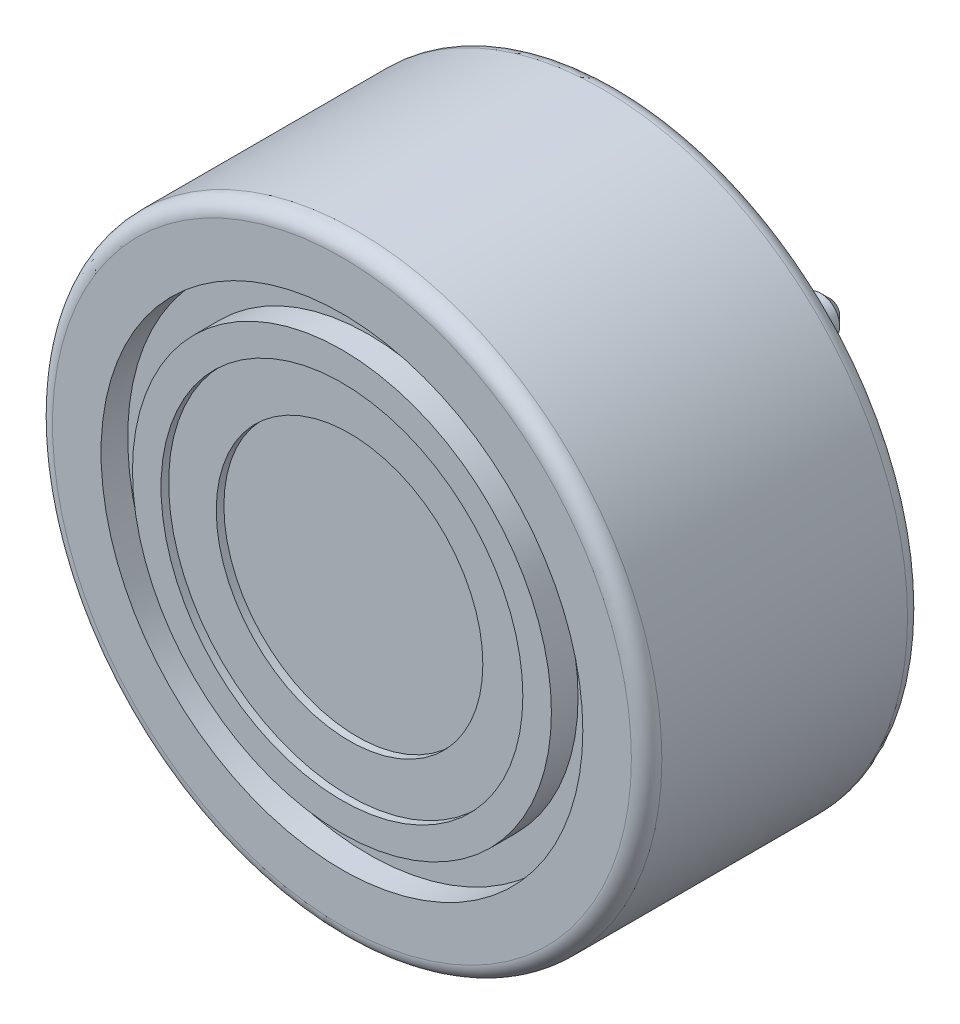
ISO-10303-21;
HEADER;
FILE_DESCRIPTION(('STEP AP214'),'2;1');
FILE_NAME('part.step','',(''),(''),'','','');
FILE_SCHEMA(('AUTOMOTIVE_DESIGN { 1 0 10303 214 1 1 1 1 }'));
ENDSEC;
DATA;
#1=APPLICATION_CONTEXT('core data for automotive mechanical design processes');
#2=APPLICATION_PROTOCOL_DEFINITION('international standard','automotive_design',2000,#1);
#3=PRODUCT_CONTEXT('',#1,'mechanical');
#4=PRODUCT('Part','Part','',(#3));
#5=PRODUCT_RELATED_PRODUCT_CATEGORY('part','',(#4));
#6=PRODUCT_DEFINITION_FORMATION('','',#4);
#7=PRODUCT_DEFINITION_CONTEXT('part definition',#1,'design');
#8=PRODUCT_DEFINITION('design','',#6,#7);
#9=PRODUCT_DEFINITION_SHAPE('','',#8);
#10=(LENGTH_UNIT() NAMED_UNIT(*) SI_UNIT(.MILLI.,.METRE.));
#11=(NAMED_UNIT(*) PLANE_ANGLE_UNIT() SI_UNIT($,.RADIAN.));
#12=(NAMED_UNIT(*) SI_UNIT($,.STERADIAN.) SOLID_ANGLE_UNIT());
#13=UNCERTAINTY_MEASURE_WITH_UNIT(LENGTH_MEASURE(1.E-05),#10,'distance_accuracy_value','');
#14=(GEOMETRIC_REPRESENTATION_CONTEXT(3) GLOBAL_UNCERTAINTY_ASSIGNED_CONTEXT((#13)) GLOBAL_UNIT_ASSIGNED_CONTEXT((#10,
#11,#12)) REPRESENTATION_CONTEXT('',''));
#15=CARTESIAN_POINT('',(0.,0.,0.));
#16=DIRECTION('',(0.,0.,1.));
#17=DIRECTION('',(1.,0.,0.));
#18=AXIS2_PLACEMENT_3D('',#15,#16,#17);
#19=CARTESIAN_POINT('',(0.,0.,14.5));
#20=DIRECTION('',(0.,0.,-1.));
#21=DIRECTION('',(-1.,0.,0.));
#22=AXIS2_PLACEMENT_3D('',#19,#20,#21);
#23=CYLINDRICAL_SURFACE('',#22,16.);
#24=CARTESIAN_POINT('',(0.,0.,0.8));
#25=DIRECTION('',(0.,0.,1.));
#26=DIRECTION('',(1.,0.,0.));
#27=AXIS2_PLACEMENT_3D('',#24,#25,#26);
#28=CIRCLE('',#27,16.);
#29=CARTESIAN_POINT('',(-16.,0.,0.799999999999999));
#30=VERTEX_POINT('',#29);
#31=EDGE_CURVE('E87',#30,#30,#28,.T.);
#32=CARTESIAN_POINT('',(0.,0.,13.7));
#33=DIRECTION('',(0.,0.,1.));
#34=DIRECTION('',(1.,0.,0.));
#35=AXIS2_PLACEMENT_3D('',#32,#33,#34);
#36=CIRCLE('',#35,16.);
#37=CARTESIAN_POINT('',(-16.,0.,13.7));
#38=VERTEX_POINT('',#37);
#39=EDGE_CURVE('E91',#38,#38,#36,.F.);
#40=CARTESIAN_POINT('',(-16.,0.,0.799999999999999));
#41=CARTESIAN_POINT('',(-16.,0.,0.934374999999999));
#42=CARTESIAN_POINT('',(-16.,0.,1.06875));
#43=CARTESIAN_POINT('',(-16.,0.,1.3375));
#44=CARTESIAN_POINT('',(-16.,0.,1.471875));
#45=CARTESIAN_POINT('',(-16.,0.,1.740625));
#46=CARTESIAN_POINT('',(-16.,0.,1.875));
#47=CARTESIAN_POINT('',(-16.,0.,2.14375));
#48=CARTESIAN_POINT('',(-16.,0.,2.278125));
#49=CARTESIAN_POINT('',(-16.,0.,2.546875));
#50=CARTESIAN_POINT('',(-16.,0.,2.68125));
#51=CARTESIAN_POINT('',(-16.,0.,2.95));
#52=CARTESIAN_POINT('',(-16.,0.,3.084375));
#53=CARTESIAN_POINT('',(-16.,0.,3.353125));
#54=CARTESIAN_POINT('',(-16.,0.,3.4875));
#55=CARTESIAN_POINT('',(-16.,0.,3.75625));
#56=CARTESIAN_POINT('',(-16.,0.,3.890625));
#57=CARTESIAN_POINT('',(-16.,0.,4.159375));
#58=CARTESIAN_POINT('',(-16.,0.,4.29375));
#59=CARTESIAN_POINT('',(-16.,0.,4.5625));
#60=CARTESIAN_POINT('',(-16.,0.,4.696875));
#61=CARTESIAN_POINT('',(-16.,0.,4.965625));
#62=CARTESIAN_POINT('',(-16.,0.,5.1));
#63=CARTESIAN_POINT('',(-16.,0.,5.36875));
#64=CARTESIAN_POINT('',(-16.,0.,5.503125));
#65=CARTESIAN_POINT('',(-16.,0.,5.771875));
#66=CARTESIAN_POINT('',(-16.,0.,5.90625));
#67=CARTESIAN_POINT('',(-16.,0.,6.175));
#68=CARTESIAN_POINT('',(-16.,0.,6.309375));
#69=CARTESIAN_POINT('',(-16.,0.,6.578125));
#70=CARTESIAN_POINT('',(-16.,0.,6.7125));
#71=CARTESIAN_POINT('',(-16.,0.,6.98125));
#72=CARTESIAN_POINT('',(-16.,0.,7.115625));
#73=CARTESIAN_POINT('',(-16.,0.,7.384375));
#74=CARTESIAN_POINT('',(-16.,0.,7.51875));
#75=CARTESIAN_POINT('',(-16.,0.,7.7875));
#76=CARTESIAN_POINT('',(-16.,0.,7.921875));
#77=CARTESIAN_POINT('',(-16.,0.,8.190625));
#78=CARTESIAN_POINT('',(-16.,0.,8.325));
#79=CARTESIAN_POINT('',(-16.,0.,8.59375));
#80=CARTESIAN_POINT('',(-16.,0.,8.728125));
#81=CARTESIAN_POINT('',(-16.,0.,8.996875));
#82=CARTESIAN_POINT('',(-16.,0.,9.13125));
#83=CARTESIAN_POINT('',(-16.,0.,9.4));
#84=CARTESIAN_POINT('',(-16.,0.,9.534375));
#85=CARTESIAN_POINT('',(-16.,0.,9.803125));
#86=CARTESIAN_POINT('',(-16.,0.,9.9375));
#87=CARTESIAN_POINT('',(-16.,0.,10.20625));
#88=CARTESIAN_POINT('',(-16.,0.,10.340625));
#89=CARTESIAN_POINT('',(-16.,0.,10.609375));
#90=CARTESIAN_POINT('',(-16.,0.,10.74375));
#91=CARTESIAN_POINT('',(-16.,0.,11.0125));
#92=CARTESIAN_POINT('',(-16.,0.,11.146875));
#93=CARTESIAN_POINT('',(-16.,0.,11.415625));
#94=CARTESIAN_POINT('',(-16.,0.,11.55));
#95=CARTESIAN_POINT('',(-16.,0.,11.81875));
#96=CARTESIAN_POINT('',(-16.,0.,11.953125));
#97=CARTESIAN_POINT('',(-16.,0.,12.221875));
#98=CARTESIAN_POINT('',(-16.,0.,12.35625));
#99=CARTESIAN_POINT('',(-16.,0.,12.625));
#100=CARTESIAN_POINT('',(-16.,0.,12.759375));
#101=CARTESIAN_POINT('',(-16.,0.,13.028125));
#102=CARTESIAN_POINT('',(-16.,0.,13.1625));
#103=CARTESIAN_POINT('',(-16.,0.,13.43125));
#104=CARTESIAN_POINT('',(-16.,0.,13.565625));
#105=CARTESIAN_POINT('',(-16.,0.,13.7));
#106=B_SPLINE_CURVE_WITH_KNOTS('',3,(#40,#41,#42,#43,#44,#45,#46,#47,#48,#49,#50,#51,#52,#53,
#54,#55,#56,#57,#58,#59,#60,#61,#62,#63,#64,#65,#66,#67,#68,#69,#70,#71,#72,#73,#74,#75,#76,#77,
#78,#79,#80,#81,#82,#83,#84,#85,#86,#87,#88,#89,#90,#91,#92,#93,#94,#95,#96,#97,#98,#99,#100,
#101,#102,#103,#104,#105),.UNSPECIFIED.,.F.,.F.,(4,2,2,2,2,2,2,2,2,2,2,2,2,2,2,2,2,2,2,2,2,2,2,
2,2,2,2,2,2,2,2,2,4),(0.,0.403125000000001,0.80625,1.209375,1.6125,2.015625,2.41875,2.821875,
3.225,3.628125,4.03125,4.434375,4.8375,5.240625,5.64375,6.046875,6.45,6.853125,7.25625,7.659375,
8.0625,8.465625,8.86875,9.271875,9.675,10.078125,10.48125,10.884375,11.2875,11.690625,12.09375,
12.496875,12.9),.UNSPECIFIED.);
#107=EDGE_CURVE('BSEAM49',#30,#38,#106,.T.);
#108=ORIENTED_EDGE('',*,*,#31,.T.);
#109=ORIENTED_EDGE('',*,*,#39,.T.);
#110=ORIENTED_EDGE('',*,*,#107,.T.);
#111=ORIENTED_EDGE('',*,*,#107,.F.);
#112=EDGE_LOOP('',(#108,#110,#109,#111));
#113=FACE_BOUND('',#112,.T.);
#114=ADVANCED_FACE('F49',(#113),#23,.T.);
#115=CARTESIAN_POINT('',(0.,0.,14.5));
#116=DIRECTION('',(0.,0.,1.));
#117=DIRECTION('',(1.,0.,0.));
#118=AXIS2_PLACEMENT_3D('',#115,#116,#117);
#119=PLANE('',#118);
#120=CARTESIAN_POINT('',(0.,0.,14.5));
#121=DIRECTION('',(0.,0.,1.));
#122=DIRECTION('',(1.,0.,0.));
#123=AXIS2_PLACEMENT_3D('',#120,#121,#122);
#124=CIRCLE('',#123,15.2);
#125=CARTESIAN_POINT('',(15.2,0.,14.5));
#126=VERTEX_POINT('',#125);
#127=EDGE_CURVE('E79',#126,#126,#124,.T.);
#128=ORIENTED_EDGE('',*,*,#127,.T.);
#129=EDGE_LOOP('',(#128));
#130=FACE_BOUND('',#129,.T.);
#131=CARTESIAN_POINT('',(0.,0.,14.5));
#132=DIRECTION('',(0.,0.,1.));
#133=DIRECTION('',(1.,0.,0.));
#134=AXIS2_PLACEMENT_3D('',#131,#132,#133);
#135=CIRCLE('',#134,12.65);
#136=CARTESIAN_POINT('',(12.65,0.,14.5));
#137=VERTEX_POINT('',#136);
#138=EDGE_CURVE('E134',#137,#137,#135,.T.);
#139=ORIENTED_EDGE('',*,*,#138,.F.);
#140=EDGE_LOOP('',(#139));
#141=FACE_BOUND('',#140,.T.);
#142=ADVANCED_FACE('F207',(#130,#141),#119,.T.);
#143=CARTESIAN_POINT('',(0.,0.,0.));
#144=DIRECTION('',(0.,0.,1.));
#145=DIRECTION('',(1.,0.,0.));
#146=AXIS2_PLACEMENT_3D('',#143,#144,#145);
#147=PLANE('',#146);
#148=CARTESIAN_POINT('',(0.,0.,0.));
#149=DIRECTION('',(0.,0.,1.));
#150=DIRECTION('',(1.,0.,0.));
#151=AXIS2_PLACEMENT_3D('',#148,#149,#150);
#152=CIRCLE('',#151,15.2);
#153=CARTESIAN_POINT('',(15.2,0.,0.));
#154=VERTEX_POINT('',#153);
#155=EDGE_CURVE('E83',#154,#154,#152,.F.);
#156=ORIENTED_EDGE('',*,*,#155,.T.);
#157=EDGE_LOOP('',(#156));
#158=FACE_BOUND('',#157,.T.);
#159=CARTESIAN_POINT('',(0.,0.,0.));
#160=DIRECTION('',(0.,0.,1.));
#161=DIRECTION('',(1.,0.,0.));
#162=AXIS2_PLACEMENT_3D('',#159,#160,#161);
#163=CIRCLE('',#162,12.);
#164=CARTESIAN_POINT('',(12.,0.,0.));
#165=VERTEX_POINT('',#164);
#166=EDGE_CURVE('E130',#165,#165,#163,.F.);
#167=ORIENTED_EDGE('',*,*,#166,.F.);
#168=EDGE_LOOP('',(#167));
#169=FACE_BOUND('',#168,.T.);
#170=ADVANCED_FACE('F212',(#158,#169),#147,.F.);
#171=CARTESIAN_POINT('',(0.,0.,-1.4));
#172=DIRECTION('',(0.,0.,-1.));
#173=DIRECTION('',(-1.,0.,0.));
#174=AXIS2_PLACEMENT_3D('',#171,#172,#173);
#175=PLANE('',#174);
#176=CARTESIAN_POINT('',(0.,0.,-1.4));
#177=DIRECTION('',(0.,0.,-1.));
#178=DIRECTION('',(-1.,0.,0.));
#179=AXIS2_PLACEMENT_3D('',#176,#177,#178);
#180=CIRCLE('',#179,11.1);
#181=CARTESIAN_POINT('',(-11.1,0.,-1.4));
#182=VERTEX_POINT('',#181);
#183=EDGE_CURVE('E57',#182,#182,#180,.F.);
#184=ORIENTED_EDGE('',*,*,#183,.T.);
#185=EDGE_LOOP('',(#184));
#186=FACE_BOUND('',#185,.T.);
#187=CARTESIAN_POINT('',(0.,0.,-1.4));
#188=DIRECTION('',(0.,0.,-1.));
#189=DIRECTION('',(-1.,0.,0.));
#190=AXIS2_PLACEMENT_3D('',#187,#188,#189);
#191=CIRCLE('',#190,11.8);
#192=CARTESIAN_POINT('',(-11.8,0.,-1.4));
#193=VERTEX_POINT('',#192);
#194=EDGE_CURVE('E65',#193,#193,#191,.T.);
#195=ORIENTED_EDGE('',*,*,#194,.T.);
#196=EDGE_LOOP('',(#195));
#197=FACE_BOUND('',#196,.T.);
#198=ADVANCED_FACE('F203',(#186,#197),#175,.T.);
#199=CARTESIAN_POINT('',(0.,0.,-1.4));
#200=DIRECTION('',(0.,0.,1.));
#201=DIRECTION('',(1.,0.,0.));
#202=AXIS2_PLACEMENT_3D('',#199,#200,#201);
#203=CYLINDRICAL_SURFACE('',#202,12.);
#204=CARTESIAN_POINT('',(0.,0.,-1.2));
#205=DIRECTION('',(0.,0.,-1.));
#206=DIRECTION('',(-1.,0.,0.));
#207=AXIS2_PLACEMENT_3D('',#204,#205,#206);
#208=CIRCLE('',#207,12.);
#209=CARTESIAN_POINT('',(-12.,0.,-1.2));
#210=VERTEX_POINT('',#209);
#211=EDGE_CURVE('E10',#210,#210,#208,.F.);
#212=ORIENTED_EDGE('',*,*,#211,.T.);
#213=EDGE_LOOP('',(#212));
#214=FACE_BOUND('',#213,.T.);
#215=ORIENTED_EDGE('',*,*,#166,.T.);
#216=EDGE_LOOP('',(#215));
#217=FACE_BOUND('',#216,.T.);
#218=ADVANCED_FACE('F198',(#214,#217),#203,.T.);
#219=CARTESIAN_POINT('',(0.,0.,-1.4));
#220=DIRECTION('',(0.,0.,1.));
#221=DIRECTION('',(1.,0.,0.));
#222=AXIS2_PLACEMENT_3D('',#219,#220,#221);
#223=CYLINDRICAL_SURFACE('',#222,10.9);
#224=CARTESIAN_POINT('',(0.,0.,-1.2));
#225=DIRECTION('',(0.,0.,-1.));
#226=DIRECTION('',(-1.,0.,0.));
#227=AXIS2_PLACEMENT_3D('',#224,#225,#226);
#228=CIRCLE('',#227,10.9);
#229=CARTESIAN_POINT('',(-10.9,0.,-1.2));
#230=VERTEX_POINT('',#229);
#231=EDGE_CURVE('E73',#230,#230,#228,.T.);
#232=ORIENTED_EDGE('',*,*,#231,.T.);
#233=EDGE_LOOP('',(#232));
#234=FACE_BOUND('',#233,.T.);
#235=CARTESIAN_POINT('',(0.,0.,-1.));
#236=DIRECTION('',(0.,0.,-1.));
#237=DIRECTION('',(-1.,0.,0.));
#238=AXIS2_PLACEMENT_3D('',#235,#236,#237);
#239=CIRCLE('',#238,10.9);
#240=CARTESIAN_POINT('',(-10.9,0.,-1.));
#241=VERTEX_POINT('',#240);
#242=EDGE_CURVE('E126',#241,#241,#239,.T.);
#243=ORIENTED_EDGE('',*,*,#242,.F.);
#244=EDGE_LOOP('',(#243));
#245=FACE_BOUND('',#244,.T.);
#246=ADVANCED_FACE('F187',(#234,#245),#223,.F.);
#247=CARTESIAN_POINT('',(0.,0.,-1.));
#248=DIRECTION('',(0.,0.,-1.));
#249=DIRECTION('',(-1.,0.,0.));
#250=AXIS2_PLACEMENT_3D('',#247,#248,#249);
#251=PLANE('',#250);
#252=CARTESIAN_POINT('',(5.93899404761905,5.94039979314065,-1.));
#253=DIRECTION('',(0.,0.,-1.));
#254=DIRECTION('',(-1.,0.,0.));
#255=AXIS2_PLACEMENT_3D('',#252,#253,#254);
#256=CIRCLE('',#255,1.);
#257=CARTESIAN_POINT('',(4.93899404761905,5.94039979314065,-1.));
#258=VERTEX_POINT('',#257);
#259=EDGE_CURVE('E175',#258,#258,#256,.T.);
#260=ORIENTED_EDGE('',*,*,#259,.F.);
#261=EDGE_LOOP('',(#260));
#262=FACE_BOUND('',#261,.T.);
#263=CARTESIAN_POINT('',(5.93899404761905,-5.94039979314065,-1.));
#264=DIRECTION('',(0.,0.,-1.));
#265=DIRECTION('',(-1.,0.,0.));
#266=AXIS2_PLACEMENT_3D('',#263,#264,#265);
#267=CIRCLE('',#266,1.);
#268=CARTESIAN_POINT('',(4.93899404761905,-5.94039979314065,-1.));
#269=VERTEX_POINT('',#268);
#270=EDGE_CURVE('E171',#269,#269,#267,.T.);
#271=ORIENTED_EDGE('',*,*,#270,.F.);
#272=EDGE_LOOP('',(#271));
#273=FACE_BOUND('',#272,.T.);
#274=CARTESIAN_POINT('',(-8.4,0.,-1.));
#275=DIRECTION('',(0.,0.,-1.));
#276=DIRECTION('',(-1.,0.,0.));
#277=AXIS2_PLACEMENT_3D('',#274,#275,#276);
#278=CIRCLE('',#277,1.);
#279=CARTESIAN_POINT('',(-9.4,0.,-1.));
#280=VERTEX_POINT('',#279);
#281=EDGE_CURVE('E167',#280,#280,#278,.T.);
#282=ORIENTED_EDGE('',*,*,#281,.F.);
#283=EDGE_LOOP('',(#282));
#284=FACE_BOUND('',#283,.T.);
#285=CARTESIAN_POINT('',(8.4,0.,-1.));
#286=DIRECTION('',(0.,0.,-1.));
#287=DIRECTION('',(-1.,0.,0.));
#288=AXIS2_PLACEMENT_3D('',#285,#286,#287);
#289=CIRCLE('',#288,1.);
#290=CARTESIAN_POINT('',(7.4,0.,-1.));
#291=VERTEX_POINT('',#290);
#292=EDGE_CURVE('E160',#291,#291,#289,.T.);
#293=ORIENTED_EDGE('',*,*,#292,.F.);
#294=EDGE_LOOP('',(#293));
#295=FACE_BOUND('',#294,.T.);
#296=ORIENTED_EDGE('',*,*,#242,.T.);
#297=EDGE_LOOP('',(#296));
#298=FACE_BOUND('',#297,.T.);
#299=ADVANCED_FACE('F183',(#262,#273,#284,#295,#298),#251,.T.);
#300=CARTESIAN_POINT('',(0.,0.,13.1));
#301=DIRECTION('',(0.,0.,1.));
#302=DIRECTION('',(1.,0.,0.));
#303=AXIS2_PLACEMENT_3D('',#300,#301,#302);
#304=CYLINDRICAL_SURFACE('',#303,12.65);
#305=CARTESIAN_POINT('',(0.,0.,13.1));
#306=DIRECTION('',(0.,0.,1.));
#307=DIRECTION('',(1.,0.,0.));
#308=AXIS2_PLACEMENT_3D('',#305,#306,#307);
#309=CIRCLE('',#308,12.65);
#310=CARTESIAN_POINT('',(12.65,0.,13.1));
#311=VERTEX_POINT('',#310);
#312=EDGE_CURVE('E133',#311,#311,#309,.T.);
#313=ORIENTED_EDGE('',*,*,#312,.F.);
#314=EDGE_LOOP('',(#313));
#315=FACE_BOUND('',#314,.T.);
#316=ORIENTED_EDGE('',*,*,#138,.T.);
#317=EDGE_LOOP('',(#316));
#318=FACE_BOUND('',#317,.T.);
#319=ADVANCED_FACE('F186',(#315,#318),#304,.F.);
#320=CARTESIAN_POINT('',(0.,0.,13.1));
#321=DIRECTION('',(0.,0.,1.));
#322=DIRECTION('',(1.,0.,0.));
#323=AXIS2_PLACEMENT_3D('',#320,#321,#322);
#324=PLANE('',#323);
#325=CARTESIAN_POINT('',(0.,0.,13.1));
#326=DIRECTION('',(0.,0.,1.));
#327=DIRECTION('',(1.,0.,0.));
#328=AXIS2_PLACEMENT_3D('',#325,#326,#327);
#329=CIRCLE('',#328,11.);
#330=CARTESIAN_POINT('',(11.,0.,13.1));
#331=VERTEX_POINT('',#330);
#332=EDGE_CURVE('E137',#331,#331,#329,.T.);
#333=ORIENTED_EDGE('',*,*,#332,.F.);
#334=EDGE_LOOP('',(#333));
#335=FACE_BOUND('',#334,.T.);
#336=ORIENTED_EDGE('',*,*,#312,.T.);
#337=EDGE_LOOP('',(#336));
#338=FACE_BOUND('',#337,.T.);
#339=ADVANCED_FACE('F457',(#335,#338),#324,.T.);
#340=CARTESIAN_POINT('',(0.,0.,13.1));
#341=DIRECTION('',(0.,0.,1.));
#342=DIRECTION('',(1.,0.,0.));
#343=AXIS2_PLACEMENT_3D('',#340,#341,#342);
#344=CYLINDRICAL_SURFACE('',#343,11.);
#345=ORIENTED_EDGE('',*,*,#332,.T.);
#346=EDGE_LOOP('',(#345));
#347=FACE_BOUND('',#346,.T.);
#348=CARTESIAN_POINT('',(0.,0.,14.5));
#349=DIRECTION('',(0.,0.,1.));
#350=DIRECTION('',(1.,0.,0.));
#351=AXIS2_PLACEMENT_3D('',#348,#349,#350);
#352=CIRCLE('',#351,11.);
#353=CARTESIAN_POINT('',(11.,0.,14.5));
#354=VERTEX_POINT('',#353);
#355=EDGE_CURVE('E141',#354,#354,#352,.T.);
#356=ORIENTED_EDGE('',*,*,#355,.F.);
#357=EDGE_LOOP('',(#356));
#358=FACE_BOUND('',#357,.T.);
#359=ADVANCED_FACE('F450',(#347,#358),#344,.T.);
#360=CARTESIAN_POINT('',(0.,0.,14.5));
#361=DIRECTION('',(0.,0.,1.));
#362=DIRECTION('',(1.,0.,0.));
#363=AXIS2_PLACEMENT_3D('',#360,#361,#362);
#364=CIRCLE('',#363,9.5);
#365=CARTESIAN_POINT('',(9.5,0.,14.5));
#366=VERTEX_POINT('',#365);
#367=EDGE_CURVE('E149',#366,#366,#364,.T.);
#368=ORIENTED_EDGE('',*,*,#367,.F.);
#369=EDGE_LOOP('',(#368));
#370=FACE_BOUND('',#369,.T.);
#371=ORIENTED_EDGE('',*,*,#355,.T.);
#372=EDGE_LOOP('',(#371));
#373=FACE_BOUND('',#372,.T.);
#374=ADVANCED_FACE('F215',(#370,#373),#119,.T.);
#375=CARTESIAN_POINT('',(0.,0.,14.1));
#376=DIRECTION('',(0.,0.,1.));
#377=DIRECTION('',(1.,0.,0.));
#378=AXIS2_PLACEMENT_3D('',#375,#376,#377);
#379=CYLINDRICAL_SURFACE('',#378,9.5);
#380=CARTESIAN_POINT('',(0.,0.,14.1));
#381=DIRECTION('',(0.,0.,1.));
#382=DIRECTION('',(1.,0.,0.));
#383=AXIS2_PLACEMENT_3D('',#380,#381,#382);
#384=CIRCLE('',#383,9.5);
#385=CARTESIAN_POINT('',(9.5,0.,14.1));
#386=VERTEX_POINT('',#385);
#387=EDGE_CURVE('E145',#386,#386,#384,.T.);
#388=ORIENTED_EDGE('',*,*,#387,.F.);
#389=EDGE_LOOP('',(#388));
#390=FACE_BOUND('',#389,.T.);
#391=ORIENTED_EDGE('',*,*,#367,.T.);
#392=EDGE_LOOP('',(#391));
#393=FACE_BOUND('',#392,.T.);
#394=ADVANCED_FACE('F430',(#390,#393),#379,.F.);
#395=CARTESIAN_POINT('',(0.,0.,14.1));
#396=DIRECTION('',(0.,0.,1.));
#397=DIRECTION('',(1.,0.,0.));
#398=AXIS2_PLACEMENT_3D('',#395,#396,#397);
#399=PLANE('',#398);
#400=CARTESIAN_POINT('',(0.,0.,14.1));
#401=DIRECTION('',(0.,0.,1.));
#402=DIRECTION('',(1.,0.,0.));
#403=AXIS2_PLACEMENT_3D('',#400,#401,#402);
#404=CIRCLE('',#403,7.);
#405=CARTESIAN_POINT('',(7.,0.,14.1));
#406=VERTEX_POINT('',#405);
#407=EDGE_CURVE('E156',#406,#406,#404,.T.);
#408=ORIENTED_EDGE('',*,*,#407,.F.);
#409=EDGE_LOOP('',(#408));
#410=FACE_BOUND('',#409,.T.);
#411=ORIENTED_EDGE('',*,*,#387,.T.);
#412=EDGE_LOOP('',(#411));
#413=FACE_BOUND('',#412,.T.);
#414=ADVANCED_FACE('F420',(#410,#413),#399,.T.);
#415=CARTESIAN_POINT('',(0.,0.,13.7));
#416=DIRECTION('',(0.,0.,1.));
#417=DIRECTION('',(1.,0.,0.));
#418=AXIS2_PLACEMENT_3D('',#415,#416,#417);
#419=CYLINDRICAL_SURFACE('',#418,7.);
#420=CARTESIAN_POINT('',(0.,0.,13.7));
#421=DIRECTION('',(0.,0.,1.));
#422=DIRECTION('',(1.,0.,0.));
#423=AXIS2_PLACEMENT_3D('',#420,#421,#422);
#424=CIRCLE('',#423,7.);
#425=CARTESIAN_POINT('',(7.,0.,13.7));
#426=VERTEX_POINT('',#425);
#427=EDGE_CURVE('E153',#426,#426,#424,.T.);
#428=ORIENTED_EDGE('',*,*,#427,.F.);
#429=EDGE_LOOP('',(#428));
#430=FACE_BOUND('',#429,.T.);
#431=ORIENTED_EDGE('',*,*,#407,.T.);
#432=EDGE_LOOP('',(#431));
#433=FACE_BOUND('',#432,.T.);
#434=ADVANCED_FACE('F410',(#430,#433),#419,.F.);
#435=CARTESIAN_POINT('',(0.,0.,13.7));
#436=DIRECTION('',(0.,0.,1.));
#437=DIRECTION('',(1.,0.,0.));
#438=AXIS2_PLACEMENT_3D('',#435,#436,#437);
#439=PLANE('',#438);
#440=ORIENTED_EDGE('',*,*,#427,.T.);
#441=EDGE_LOOP('',(#440));
#442=FACE_BOUND('',#441,.T.);
#443=ADVANCED_FACE('F391',(#442),#439,.T.);
#444=CARTESIAN_POINT('',(8.4,0.,-5.2));
#445=DIRECTION('',(0.,0.,1.));
#446=DIRECTION('',(1.,0.,0.));
#447=AXIS2_PLACEMENT_3D('',#444,#445,#446);
#448=CYLINDRICAL_SURFACE('',#447,1.);
#449=CARTESIAN_POINT('',(8.4,0.,-4.7));
#450=DIRECTION('',(0.,0.,-1.));
#451=DIRECTION('',(-1.,0.,0.));
#452=AXIS2_PLACEMENT_3D('',#449,#450,#451);
#453=CIRCLE('',#452,1.);
#454=CARTESIAN_POINT('',(7.4,0.,-4.7));
#455=VERTEX_POINT('',#454);
#456=EDGE_CURVE('E102',#455,#455,#453,.F.);
#457=ORIENTED_EDGE('',*,*,#456,.T.);
#458=EDGE_LOOP('',(#457));
#459=FACE_BOUND('',#458,.T.);
#460=ORIENTED_EDGE('',*,*,#292,.T.);
#461=EDGE_LOOP('',(#460));
#462=FACE_BOUND('',#461,.T.);
#463=ADVANCED_FACE('F381',(#459,#462),#448,.T.);
#464=CARTESIAN_POINT('',(8.4,0.,-5.2));
#465=DIRECTION('',(0.,0.,-1.));
#466=DIRECTION('',(-1.,0.,0.));
#467=AXIS2_PLACEMENT_3D('',#464,#465,#466);
#468=PLANE('',#467);
#469=CARTESIAN_POINT('',(8.4,0.,-5.2));
#470=DIRECTION('',(0.,0.,-1.));
#471=DIRECTION('',(-1.,0.,0.));
#472=AXIS2_PLACEMENT_3D('',#469,#470,#471);
#473=CIRCLE('',#472,0.5);
#474=CARTESIAN_POINT('',(7.9,0.,-5.2));
#475=VERTEX_POINT('',#474);
#476=EDGE_CURVE('E106',#475,#475,#473,.T.);
#477=ORIENTED_EDGE('',*,*,#476,.T.);
#478=EDGE_LOOP('',(#477));
#479=FACE_BOUND('',#478,.T.);
#480=ADVANCED_FACE('F371',(#479),#468,.T.);
#481=CARTESIAN_POINT('',(-8.4,0.,-5.2));
#482=DIRECTION('',(0.,0.,1.));
#483=DIRECTION('',(1.,0.,0.));
#484=AXIS2_PLACEMENT_3D('',#481,#482,#483);
#485=CYLINDRICAL_SURFACE('',#484,1.);
#486=CARTESIAN_POINT('',(-8.4,0.,-4.7));
#487=DIRECTION('',(0.,0.,-1.));
#488=DIRECTION('',(-1.,0.,0.));
#489=AXIS2_PLACEMENT_3D('',#486,#487,#488);
#490=CIRCLE('',#489,1.);
#491=CARTESIAN_POINT('',(-9.4,0.,-4.7));
#492=VERTEX_POINT('',#491);
#493=EDGE_CURVE('E110',#492,#492,#490,.F.);
#494=ORIENTED_EDGE('',*,*,#493,.T.);
#495=EDGE_LOOP('',(#494));
#496=FACE_BOUND('',#495,.T.);
#497=ORIENTED_EDGE('',*,*,#281,.T.);
#498=EDGE_LOOP('',(#497));
#499=FACE_BOUND('',#498,.T.);
#500=ADVANCED_FACE('F361',(#496,#499),#485,.T.);
#501=CARTESIAN_POINT('',(-8.4,0.,-5.2));
#502=DIRECTION('',(0.,0.,-1.));
#503=DIRECTION('',(-1.,0.,0.));
#504=AXIS2_PLACEMENT_3D('',#501,#502,#503);
#505=PLANE('',#504);
#506=CARTESIAN_POINT('',(-8.4,0.,-5.2));
#507=DIRECTION('',(0.,0.,-1.));
#508=DIRECTION('',(-1.,0.,0.));
#509=AXIS2_PLACEMENT_3D('',#506,#507,#508);
#510=CIRCLE('',#509,0.5);
#511=CARTESIAN_POINT('',(-8.9,0.,-5.2));
#512=VERTEX_POINT('',#511);
#513=EDGE_CURVE('E114',#512,#512,#510,.T.);
#514=ORIENTED_EDGE('',*,*,#513,.T.);
#515=EDGE_LOOP('',(#514));
#516=FACE_BOUND('',#515,.T.);
#517=ADVANCED_FACE('F351',(#516),#505,.T.);
#518=CARTESIAN_POINT('',(5.93899404761905,-5.94039979314065,-5.2));
#519=DIRECTION('',(0.,0.,1.));
#520=DIRECTION('',(1.,0.,0.));
#521=AXIS2_PLACEMENT_3D('',#518,#519,#520);
#522=CYLINDRICAL_SURFACE('',#521,1.);
#523=CARTESIAN_POINT('',(5.93899404761905,-5.94039979314065,-4.7));
#524=DIRECTION('',(0.,0.,-1.));
#525=DIRECTION('',(-1.,0.,0.));
#526=AXIS2_PLACEMENT_3D('',#523,#524,#525);
#527=CIRCLE('',#526,1.);
#528=CARTESIAN_POINT('',(4.93899404761905,-5.94039979314065,-4.7));
#529=VERTEX_POINT('',#528);
#530=EDGE_CURVE('E94',#529,#529,#527,.F.);
#531=ORIENTED_EDGE('',*,*,#530,.T.);
#532=EDGE_LOOP('',(#531));
#533=FACE_BOUND('',#532,.T.);
#534=ORIENTED_EDGE('',*,*,#270,.T.);
#535=EDGE_LOOP('',(#534));
#536=FACE_BOUND('',#535,.T.);
#537=ADVANCED_FACE('F341',(#533,#536),#522,.T.);
#538=CARTESIAN_POINT('',(5.93899404761905,-5.94039979314065,-5.2));
#539=DIRECTION('',(0.,0.,-1.));
#540=DIRECTION('',(-1.,0.,0.));
#541=AXIS2_PLACEMENT_3D('',#538,#539,#540);
#542=PLANE('',#541);
#543=CARTESIAN_POINT('',(5.93899404761905,-5.94039979314065,-5.2));
#544=DIRECTION('',(0.,0.,-1.));
#545=DIRECTION('',(-1.,0.,0.));
#546=AXIS2_PLACEMENT_3D('',#543,#544,#545);
#547=CIRCLE('',#546,0.5);
#548=CARTESIAN_POINT('',(5.43899404761905,-5.94039979314065,-5.2));
#549=VERTEX_POINT('',#548);
#550=EDGE_CURVE('E98',#549,#549,#547,.T.);
#551=ORIENTED_EDGE('',*,*,#550,.T.);
#552=EDGE_LOOP('',(#551));
#553=FACE_BOUND('',#552,.T.);
#554=ADVANCED_FACE('F331',(#553),#542,.T.);
#555=CARTESIAN_POINT('',(5.93899404761905,5.94039979314065,-5.2));
#556=DIRECTION('',(0.,0.,1.));
#557=DIRECTION('',(1.,0.,0.));
#558=AXIS2_PLACEMENT_3D('',#555,#556,#557);
#559=CYLINDRICAL_SURFACE('',#558,1.);
#560=CARTESIAN_POINT('',(5.93899404761905,5.94039979314065,-4.7));
#561=DIRECTION('',(0.,0.,-1.));
#562=DIRECTION('',(-1.,0.,0.));
#563=AXIS2_PLACEMENT_3D('',#560,#561,#562);
#564=CIRCLE('',#563,1.);
#565=CARTESIAN_POINT('',(4.93899404761905,5.94039979314065,-4.7));
#566=VERTEX_POINT('',#565);
#567=EDGE_CURVE('E118',#566,#566,#564,.F.);
#568=ORIENTED_EDGE('',*,*,#567,.T.);
#569=EDGE_LOOP('',(#568));
#570=FACE_BOUND('',#569,.T.);
#571=ORIENTED_EDGE('',*,*,#259,.T.);
#572=EDGE_LOOP('',(#571));
#573=FACE_BOUND('',#572,.T.);
#574=ADVANCED_FACE('F181',(#570,#573),#559,.T.);
#575=CARTESIAN_POINT('',(5.93899404761905,5.94039979314065,-5.2));
#576=DIRECTION('',(0.,0.,-1.));
#577=DIRECTION('',(-1.,0.,0.));
#578=AXIS2_PLACEMENT_3D('',#575,#576,#577);
#579=PLANE('',#578);
#580=CARTESIAN_POINT('',(5.93899404761905,5.94039979314065,-5.2));
#581=DIRECTION('',(0.,0.,-1.));
#582=DIRECTION('',(-1.,0.,0.));
#583=AXIS2_PLACEMENT_3D('',#580,#581,#582);
#584=CIRCLE('',#583,0.5);
#585=CARTESIAN_POINT('',(5.43899404761905,5.94039979314065,-5.2));
#586=VERTEX_POINT('',#585);
#587=EDGE_CURVE('E122',#586,#586,#584,.T.);
#588=ORIENTED_EDGE('',*,*,#587,.T.);
#589=EDGE_LOOP('',(#588));
#590=FACE_BOUND('',#589,.T.);
#591=ADVANCED_FACE('F227',(#590),#579,.T.);
#592=CARTESIAN_POINT('',(5.93899404761905,5.94039979314065,-5.2));
#593=DIRECTION('',(0.,0.,1.));
#594=DIRECTION('',(1.,0.,0.));
#595=AXIS2_PLACEMENT_3D('',#592,#593,#594);
#596=CONICAL_SURFACE('',#595,0.5,0.785398163397445);
#597=ORIENTED_EDGE('',*,*,#567,.F.);
#598=EDGE_LOOP('',(#597));
#599=FACE_BOUND('',#598,.T.);
#600=ORIENTED_EDGE('',*,*,#587,.F.);
#601=EDGE_LOOP('',(#600));
#602=FACE_BOUND('',#601,.T.);
#603=ADVANCED_FACE('F220',(#599,#602),#596,.T.);
#604=CARTESIAN_POINT('',(-8.4,0.,-5.2));
#605=DIRECTION('',(0.,0.,1.));
#606=DIRECTION('',(1.,0.,0.));
#607=AXIS2_PLACEMENT_3D('',#604,#605,#606);
#608=CONICAL_SURFACE('',#607,0.5,0.785398163397445);
#609=ORIENTED_EDGE('',*,*,#493,.F.);
#610=EDGE_LOOP('',(#609));
#611=FACE_BOUND('',#610,.T.);
#612=ORIENTED_EDGE('',*,*,#513,.F.);
#613=EDGE_LOOP('',(#612));
#614=FACE_BOUND('',#613,.T.);
#615=ADVANCED_FACE('F226',(#611,#614),#608,.T.);
#616=CARTESIAN_POINT('',(8.4,0.,-5.2));
#617=DIRECTION('',(0.,0.,1.));
#618=DIRECTION('',(1.,0.,0.));
#619=AXIS2_PLACEMENT_3D('',#616,#617,#618);
#620=CONICAL_SURFACE('',#619,0.5,0.785398163397445);
#621=ORIENTED_EDGE('',*,*,#456,.F.);
#622=EDGE_LOOP('',(#621));
#623=FACE_BOUND('',#622,.T.);
#624=ORIENTED_EDGE('',*,*,#476,.F.);
#625=EDGE_LOOP('',(#624));
#626=FACE_BOUND('',#625,.T.);
#627=ADVANCED_FACE('F234',(#623,#626),#620,.T.);
#628=CARTESIAN_POINT('',(5.93899404761905,-5.94039979314065,-5.2));
#629=DIRECTION('',(0.,0.,1.));
#630=DIRECTION('',(1.,0.,0.));
#631=AXIS2_PLACEMENT_3D('',#628,#629,#630);
#632=CONICAL_SURFACE('',#631,0.5,0.785398163397445);
#633=ORIENTED_EDGE('',*,*,#530,.F.);
#634=EDGE_LOOP('',(#633));
#635=FACE_BOUND('',#634,.T.);
#636=ORIENTED_EDGE('',*,*,#550,.F.);
#637=EDGE_LOOP('',(#636));
#638=FACE_BOUND('',#637,.T.);
#639=ADVANCED_FACE('F241',(#635,#638),#632,.T.);
#640=CARTESIAN_POINT('',(0.,0.,0.8));
#641=DIRECTION('',(0.,0.,1.));
#642=DIRECTION('',(1.,0.,0.));
#643=AXIS2_PLACEMENT_3D('',#640,#641,#642);
#644=TOROIDAL_SURFACE('',#643,15.2,0.8);
#645=ORIENTED_EDGE('',*,*,#155,.F.);
#646=EDGE_LOOP('',(#645));
#647=FACE_BOUND('',#646,.T.);
#648=ORIENTED_EDGE('',*,*,#31,.F.);
#649=EDGE_LOOP('',(#648));
#650=FACE_BOUND('',#649,.T.);
#651=ADVANCED_FACE('F247',(#647,#650),#644,.T.);
#652=CARTESIAN_POINT('',(0.,0.,13.7));
#653=DIRECTION('',(0.,0.,1.));
#654=DIRECTION('',(1.,0.,0.));
#655=AXIS2_PLACEMENT_3D('',#652,#653,#654);
#656=TOROIDAL_SURFACE('',#655,15.2,0.8);
#657=ORIENTED_EDGE('',*,*,#39,.F.);
#658=EDGE_LOOP('',(#657));
#659=FACE_BOUND('',#658,.T.);
#660=ORIENTED_EDGE('',*,*,#127,.F.);
#661=EDGE_LOOP('',(#660));
#662=FACE_BOUND('',#661,.T.);
#663=ADVANCED_FACE('F251',(#659,#662),#656,.T.);
#664=CARTESIAN_POINT('',(0.,0.,-1.2));
#665=DIRECTION('',(0.,0.,-1.));
#666=DIRECTION('',(-1.,0.,0.));
#667=AXIS2_PLACEMENT_3D('',#664,#665,#666);
#668=TOROIDAL_SURFACE('',#667,11.1,0.2);
#669=ORIENTED_EDGE('',*,*,#183,.F.);
#670=EDGE_LOOP('',(#669));
#671=FACE_BOUND('',#670,.T.);
#672=ORIENTED_EDGE('',*,*,#231,.F.);
#673=EDGE_LOOP('',(#672));
#674=FACE_BOUND('',#673,.T.);
#675=ADVANCED_FACE('F254',(#671,#674),#668,.T.);
#676=CARTESIAN_POINT('',(0.,0.,-1.2));
#677=DIRECTION('',(0.,0.,-1.));
#678=DIRECTION('',(-1.,0.,0.));
#679=AXIS2_PLACEMENT_3D('',#676,#677,#678);
#680=TOROIDAL_SURFACE('',#679,11.8,0.2);
#681=ORIENTED_EDGE('',*,*,#211,.F.);
#682=EDGE_LOOP('',(#681));
#683=FACE_BOUND('',#682,.T.);
#684=ORIENTED_EDGE('',*,*,#194,.F.);
#685=EDGE_LOOP('',(#684));
#686=FACE_BOUND('',#685,.T.);
#687=ADVANCED_FACE('F51',(#683,#686),#680,.T.);
#688=CLOSED_SHELL('',(#114,#142,#170,#198,#218,#246,#299,#319,#339,#359,#374,#394,#414,#434,
#443,#463,#480,#500,#517,#537,#554,#574,#591,#603,#615,#627,#639,#651,#663,#675,#687));
#689=MANIFOLD_SOLID_BREP('B2',#688);
#690=ADVANCED_BREP_SHAPE_REPRESENTATION('',(#18,#689),#14);
#691=SHAPE_DEFINITION_REPRESENTATION(#9,#690);
ENDSEC;
END-ISO-10303-21;
